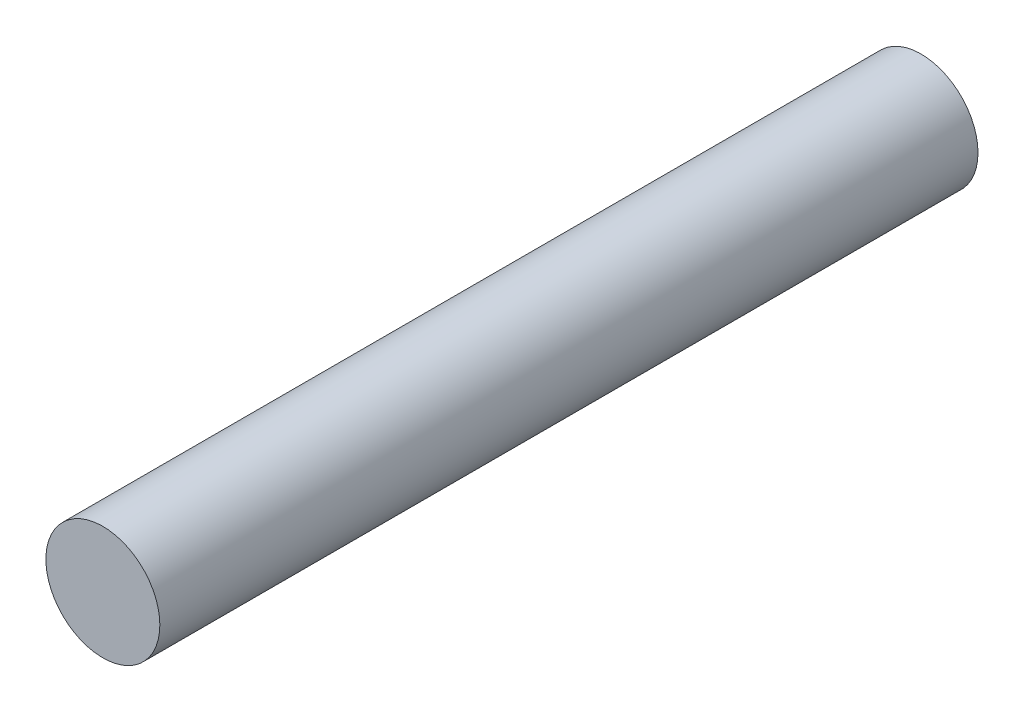
ISO-10303-21;
HEADER;
FILE_DESCRIPTION(('STEP AP214'),'2;1');
FILE_NAME('part.step','',(''),(''),'','','');
FILE_SCHEMA(('AUTOMOTIVE_DESIGN { 1 0 10303 214 1 1 1 1 }'));
ENDSEC;
DATA;
#1=APPLICATION_CONTEXT('core data for automotive mechanical design processes');
#2=APPLICATION_PROTOCOL_DEFINITION('international standard','automotive_design',2000,#1);
#3=PRODUCT_CONTEXT('',#1,'mechanical');
#4=PRODUCT('Part','Part','',(#3));
#5=PRODUCT_RELATED_PRODUCT_CATEGORY('part','',(#4));
#6=PRODUCT_DEFINITION_FORMATION('','',#4);
#7=PRODUCT_DEFINITION_CONTEXT('part definition',#1,'design');
#8=PRODUCT_DEFINITION('design','',#6,#7);
#9=PRODUCT_DEFINITION_SHAPE('','',#8);
#10=(LENGTH_UNIT() NAMED_UNIT(*) SI_UNIT(.MILLI.,.METRE.));
#11=(NAMED_UNIT(*) PLANE_ANGLE_UNIT() SI_UNIT($,.RADIAN.));
#12=(NAMED_UNIT(*) SI_UNIT($,.STERADIAN.) SOLID_ANGLE_UNIT());
#13=UNCERTAINTY_MEASURE_WITH_UNIT(LENGTH_MEASURE(1.E-05),#10,'distance_accuracy_value','');
#14=(GEOMETRIC_REPRESENTATION_CONTEXT(3) GLOBAL_UNCERTAINTY_ASSIGNED_CONTEXT((#13)) GLOBAL_UNIT_ASSIGNED_CONTEXT((#10,
#11,#12)) REPRESENTATION_CONTEXT('',''));
#15=CARTESIAN_POINT('',(0.,0.,0.));
#16=DIRECTION('',(0.,0.,1.));
#17=DIRECTION('',(1.,0.,0.));
#18=AXIS2_PLACEMENT_3D('',#15,#16,#17);
#19=CARTESIAN_POINT('',(0.,0.,35.9));
#20=DIRECTION('',(0.,0.,-1.));
#21=DIRECTION('',(-1.,0.,0.));
#22=AXIS2_PLACEMENT_3D('',#19,#20,#21);
#23=CYLINDRICAL_SURFACE('',#22,2.5);
#24=CARTESIAN_POINT('',(0.,0.,35.9));
#25=DIRECTION('',(0.,0.,1.));
#26=DIRECTION('',(1.,0.,0.));
#27=AXIS2_PLACEMENT_3D('',#24,#25,#26);
#28=CIRCLE('',#27,2.5);
#29=CARTESIAN_POINT('',(2.5,0.,35.9));
#30=VERTEX_POINT('',#29);
#31=EDGE_CURVE('E10',#30,#30,#28,.T.);
#32=ORIENTED_EDGE('',*,*,#31,.F.);
#33=EDGE_LOOP('',(#32));
#34=FACE_BOUND('',#33,.T.);
#35=CARTESIAN_POINT('',(0.,0.,0.));
#36=DIRECTION('',(0.,0.,1.));
#37=DIRECTION('',(1.,0.,0.));
#38=AXIS2_PLACEMENT_3D('',#35,#36,#37);
#39=CIRCLE('',#38,2.5);
#40=CARTESIAN_POINT('',(2.5,0.,0.));
#41=VERTEX_POINT('',#40);
#42=EDGE_CURVE('E42',#41,#41,#39,.T.);
#43=ORIENTED_EDGE('',*,*,#42,.T.);
#44=EDGE_LOOP('',(#43));
#45=FACE_BOUND('',#44,.T.);
#46=ADVANCED_FACE('F39',(#34,#45),#23,.T.);
#47=CARTESIAN_POINT('',(0.,0.,35.9));
#48=DIRECTION('',(0.,0.,1.));
#49=DIRECTION('',(1.,0.,0.));
#50=AXIS2_PLACEMENT_3D('',#47,#48,#49);
#51=PLANE('',#50);
#52=ORIENTED_EDGE('',*,*,#31,.T.);
#53=EDGE_LOOP('',(#52));
#54=FACE_BOUND('',#53,.T.);
#55=ADVANCED_FACE('F54',(#54),#51,.T.);
#56=CARTESIAN_POINT('',(0.,0.,0.));
#57=DIRECTION('',(0.,0.,1.));
#58=DIRECTION('',(1.,0.,0.));
#59=AXIS2_PLACEMENT_3D('',#56,#57,#58);
#60=PLANE('',#59);
#61=ORIENTED_EDGE('',*,*,#42,.F.);
#62=EDGE_LOOP('',(#61));
#63=FACE_BOUND('',#62,.T.);
#64=ADVANCED_FACE('F52',(#63),#60,.F.);
#65=CLOSED_SHELL('',(#46,#55,#64));
#66=MANIFOLD_SOLID_BREP('B2',#65);
#67=ADVANCED_BREP_SHAPE_REPRESENTATION('',(#18,#66),#14);
#68=SHAPE_DEFINITION_REPRESENTATION(#9,#67);
ENDSEC;
END-ISO-10303-21;
